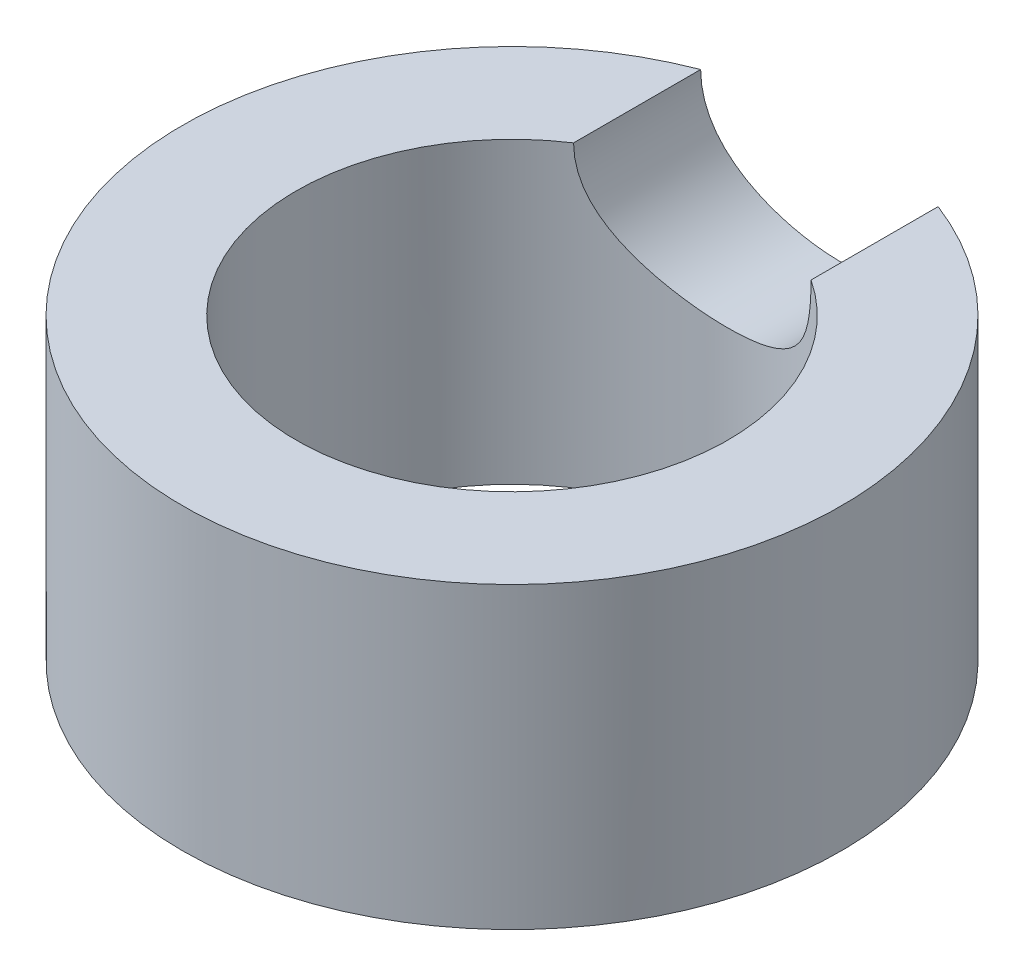
ISO-10303-21;
HEADER;
FILE_DESCRIPTION(('STEP AP214'),'2;1');
FILE_NAME('part.step','',(''),(''),'','','');
FILE_SCHEMA(('AUTOMOTIVE_DESIGN { 1 0 10303 214 1 1 1 1 }'));
ENDSEC;
DATA;
#1=APPLICATION_CONTEXT('core data for automotive mechanical design processes');
#2=APPLICATION_PROTOCOL_DEFINITION('international standard','automotive_design',2000,#1);
#3=PRODUCT_CONTEXT('',#1,'mechanical');
#4=PRODUCT('Part','Part','',(#3));
#5=PRODUCT_RELATED_PRODUCT_CATEGORY('part','',(#4));
#6=PRODUCT_DEFINITION_FORMATION('','',#4);
#7=PRODUCT_DEFINITION_CONTEXT('part definition',#1,'design');
#8=PRODUCT_DEFINITION('design','',#6,#7);
#9=PRODUCT_DEFINITION_SHAPE('','',#8);
#10=(LENGTH_UNIT() NAMED_UNIT(*) SI_UNIT(.MILLI.,.METRE.));
#11=(NAMED_UNIT(*) PLANE_ANGLE_UNIT() SI_UNIT($,.RADIAN.));
#12=(NAMED_UNIT(*) SI_UNIT($,.STERADIAN.) SOLID_ANGLE_UNIT());
#13=UNCERTAINTY_MEASURE_WITH_UNIT(LENGTH_MEASURE(1.E-05),#10,'distance_accuracy_value','');
#14=(GEOMETRIC_REPRESENTATION_CONTEXT(3) GLOBAL_UNCERTAINTY_ASSIGNED_CONTEXT((#13)) GLOBAL_UNIT_ASSIGNED_CONTEXT((#10,
#11,#12)) REPRESENTATION_CONTEXT('',''));
#15=CARTESIAN_POINT('',(0.,0.,0.));
#16=DIRECTION('',(0.,0.,1.));
#17=DIRECTION('',(1.,0.,0.));
#18=AXIS2_PLACEMENT_3D('',#15,#16,#17);
#19=CARTESIAN_POINT('',(0.,26.3,0.));
#20=DIRECTION('',(0.,1.,0.));
#21=DIRECTION('',(0.,0.,1.));
#22=AXIS2_PLACEMENT_3D('',#19,#20,#21);
#23=PLANE('',#22);
#24=DIRECTION('',(0.,0.,1.));
#25=VECTOR('',#24,1.);
#26=CARTESIAN_POINT('',(-10.45,26.3,-29.));
#27=LINE('',#26,#25);
#28=CARTESIAN_POINT('',(-10.45,26.3,-27.0517559504));
#29=VERTEX_POINT('',#28);
#30=CARTESIAN_POINT('',(-10.45,26.3,-15.8681284340656));
#31=VERTEX_POINT('',#30);
#32=EDGE_CURVE('E54',#29,#31,#27,.T.);
#33=ORIENTED_EDGE('',*,*,#32,.F.);
#34=CARTESIAN_POINT('',(0.,26.3,0.));
#35=DIRECTION('',(0.,1.,0.));
#36=DIRECTION('',(0.,0.,1.));
#37=AXIS2_PLACEMENT_3D('',#34,#35,#36);
#38=CIRCLE('',#37,29.);
#39=CARTESIAN_POINT('',(10.45,26.3,-27.0517559504));
#40=VERTEX_POINT('',#39);
#41=EDGE_CURVE('E48',#29,#40,#38,.T.);
#42=ORIENTED_EDGE('',*,*,#41,.T.);
#43=DIRECTION('',(0.,0.,1.));
#44=VECTOR('',#43,1.);
#45=CARTESIAN_POINT('',(10.45,26.3,-29.));
#46=LINE('',#45,#44);
#47=CARTESIAN_POINT('',(10.45,26.3,-15.8681284340656));
#48=VERTEX_POINT('',#47);
#49=EDGE_CURVE('E65',#48,#40,#46,.F.);
#50=ORIENTED_EDGE('',*,*,#49,.F.);
#51=CARTESIAN_POINT('',(0.,26.3,0.));
#52=DIRECTION('',(0.,1.,0.));
#53=DIRECTION('',(0.,0.,1.));
#54=AXIS2_PLACEMENT_3D('',#51,#52,#53);
#55=CIRCLE('',#54,19.);
#56=EDGE_CURVE('E71',#31,#48,#55,.T.);
#57=ORIENTED_EDGE('',*,*,#56,.F.);
#58=EDGE_LOOP('',(#33,#42,#50,#57));
#59=FACE_BOUND('',#58,.T.);
#60=ADVANCED_FACE('F33',(#59),#23,.T.);
#61=CARTESIAN_POINT('',(0.,0.,0.));
#62=DIRECTION('',(0.,1.,0.));
#63=DIRECTION('',(0.,0.,1.));
#64=AXIS2_PLACEMENT_3D('',#61,#62,#63);
#65=PLANE('',#64);
#66=CARTESIAN_POINT('',(0.,0.,0.));
#67=DIRECTION('',(0.,1.,0.));
#68=DIRECTION('',(0.,0.,1.));
#69=AXIS2_PLACEMENT_3D('',#66,#67,#68);
#70=CIRCLE('',#69,29.);
#71=CARTESIAN_POINT('',(0.,0.,29.));
#72=VERTEX_POINT('',#71);
#73=EDGE_CURVE('E76',#72,#72,#70,.T.);
#74=ORIENTED_EDGE('',*,*,#73,.F.);
#75=EDGE_LOOP('',(#74));
#76=FACE_BOUND('',#75,.T.);
#77=CARTESIAN_POINT('',(0.,0.,0.));
#78=DIRECTION('',(0.,1.,0.));
#79=DIRECTION('',(0.,0.,1.));
#80=AXIS2_PLACEMENT_3D('',#77,#78,#79);
#81=CIRCLE('',#80,19.);
#82=CARTESIAN_POINT('',(0.,0.,19.));
#83=VERTEX_POINT('',#82);
#84=EDGE_CURVE('E77',#83,#83,#81,.T.);
#85=ORIENTED_EDGE('',*,*,#84,.T.);
#86=EDGE_LOOP('',(#85));
#87=FACE_BOUND('',#86,.T.);
#88=ADVANCED_FACE('F96',(#76,#87),#65,.F.);
#89=CARTESIAN_POINT('',(0.,26.3,0.));
#90=DIRECTION('',(0.,-1.,0.));
#91=DIRECTION('',(0.,0.,-1.));
#92=AXIS2_PLACEMENT_3D('',#89,#90,#91);
#93=CYLINDRICAL_SURFACE('',#92,29.);
#94=ORIENTED_EDGE('',*,*,#41,.F.);
#95=CARTESIAN_POINT('',(-10.45,26.3,-27.0517559504));
#96=CARTESIAN_POINT('',(-10.4500420347106,26.0164141954072,-27.0517043468938));
#97=CARTESIAN_POINT('',(-10.4384582900409,25.7328484891242,-27.0562135064838));
#98=CARTESIAN_POINT('',(-10.3923533101106,25.1679492759978,-27.0739748153919));
#99=CARTESIAN_POINT('',(-10.3578392161113,24.8866151017773,-27.0872242426955));
#100=CARTESIAN_POINT('',(-10.2663397274534,24.3291208230481,-27.1220299848386));
#101=CARTESIAN_POINT('',(-10.2094294851695,24.0529466172667,-27.1435585129282));
#102=CARTESIAN_POINT('',(-10.0736989221395,23.5067456528368,-27.1942248619088));
#103=CARTESIAN_POINT('',(-9.99487760715423,23.2367191737498,-27.2233630280918));
#104=CARTESIAN_POINT('',(-9.81612541506079,22.704890681953,-27.2883252534546));
#105=CARTESIAN_POINT('',(-9.71621576569784,22.4430807005817,-27.3241425851209));
#106=CARTESIAN_POINT('',(-9.49602608490442,21.9289327238641,-27.4014434152163));
#107=CARTESIAN_POINT('',(-9.37573845850375,21.6765983030991,-27.4429290251205));
#108=CARTESIAN_POINT('',(-9.11565980665934,21.1828580662941,-27.5304116973908));
#109=CARTESIAN_POINT('',(-8.97585950061417,20.9414575234054,-27.5764109033989));
#110=CARTESIAN_POINT('',(-8.67774496392956,20.471038312997,-27.6716682434378));
#111=CARTESIAN_POINT('',(-8.51942948657005,20.2420204807881,-27.7209265968263));
#112=CARTESIAN_POINT('',(-8.1783532178767,19.7884057396902,-27.8235070049463));
#113=CARTESIAN_POINT('',(-7.99485172295566,19.5643844132757,-27.8769128700475));
#114=CARTESIAN_POINT('',(-7.60999364051448,19.1324216665352,-27.984422606139));
#115=CARTESIAN_POINT('',(-7.4086366635212,18.9244805971454,-28.038526492333));
#116=CARTESIAN_POINT('',(-6.98922455227901,18.5258793935119,-28.1460051192097));
#117=CARTESIAN_POINT('',(-6.77116606714592,18.3352227439477,-28.1993797110269));
#118=CARTESIAN_POINT('',(-6.31966720373456,17.9724451862077,-28.30398376654));
#119=CARTESIAN_POINT('',(-6.08622729607372,17.800323711345,-28.355213295789));
#120=CARTESIAN_POINT('',(-5.59776540045549,17.4706717808932,-28.4557396366489));
#121=CARTESIAN_POINT('',(-5.34229576701858,17.313769667686,-28.5049251534369));
#122=CARTESIAN_POINT('',(-4.81819953670834,17.0222128334194,-28.598177522385));
#123=CARTESIAN_POINT('',(-4.54957824539634,16.8875492353605,-28.6422464148639));
#124=CARTESIAN_POINT('',(-4.0009304665911,16.6415619344381,-28.7240224277536));
#125=CARTESIAN_POINT('',(-3.72090469945483,16.5302367601392,-28.7617299492052));
#126=CARTESIAN_POINT('',(-3.15147124006535,16.331970836778,-28.829679557322));
#127=CARTESIAN_POINT('',(-2.86206402532538,16.2450288487852,-28.8599220232835));
#128=CARTESIAN_POINT('',(-2.28785493498111,16.0993921327907,-28.9109917080171));
#129=CARTESIAN_POINT('',(-2.00333408881766,16.0397041116403,-28.9321479733921));
#130=CARTESIAN_POINT('',(-1.42982129044734,15.9441991641431,-28.9661546281748));
#131=CARTESIAN_POINT('',(-1.14082944731271,15.9083816563995,-28.9790052198775));
#132=CARTESIAN_POINT('',(-0.560678879709502,15.8609949871443,-28.9960313858068));
#133=CARTESIAN_POINT('',(-0.26952068989115,15.8494200296107,-29.0002090335992));
#134=CARTESIAN_POINT('',(0.312734806425992,15.8506246465023,-28.9997748676108));
#135=CARTESIAN_POINT('',(0.603832114382947,15.8634035489806,-28.9951632963333));
#136=CARTESIAN_POINT('',(1.17038196262185,15.9120354464162,-28.9776953432902));
#137=CARTESIAN_POINT('',(1.44594031930987,15.9468046299265,-28.9652263232189));
#138=CARTESIAN_POINT('',(1.99297364278444,16.0380584371896,-28.9327345282788));
#139=CARTESIAN_POINT('',(2.2644487568015,16.0945422760117,-28.9127120264502));
#140=CARTESIAN_POINT('',(2.80148216586523,16.2287138066125,-28.865625989761));
#141=CARTESIAN_POINT('',(3.06704032483467,16.3064019855021,-28.8385622931492));
#142=CARTESIAN_POINT('',(3.59051770846455,16.4823153444254,-28.7780752435371));
#143=CARTESIAN_POINT('',(3.84843674464674,16.580541030695,-28.7446517337734));
#144=CARTESIAN_POINT('',(4.35857346083338,16.7982467749626,-28.6717657468143));
#145=CARTESIAN_POINT('',(4.61066189598389,16.9180035257151,-28.6322257208561));
#146=CARTESIAN_POINT('',(5.10393720166782,17.1769548805522,-28.5484227923349));
#147=CARTESIAN_POINT('',(5.34512009308556,17.3161565049481,-28.5041581853929));
#148=CARTESIAN_POINT('',(5.8151378714156,17.6130019144401,-28.411996307252));
#149=CARTESIAN_POINT('',(6.04397205581615,17.7706467471483,-28.3640988297529));
#150=CARTESIAN_POINT('',(6.48804335191334,18.1033677864734,-28.2658277976439));
#151=CARTESIAN_POINT('',(6.70327959286284,18.2784451075379,-28.2154540848342));
#152=CARTESIAN_POINT('',(7.13029934974788,18.6549560262958,-28.1106697752738));
#153=CARTESIAN_POINT('',(7.34125927844249,18.8573049611028,-28.0561885814523));
#154=CARTESIAN_POINT('',(7.74550895494481,19.2789671559337,-27.947288313059));
#155=CARTESIAN_POINT('',(7.9387981319775,19.4982809635103,-27.8928692405497));
#156=CARTESIAN_POINT('',(8.30657087260514,19.9526511640103,-27.7855645190033));
#157=CARTESIAN_POINT('',(8.48104707362154,20.1877136623549,-27.7326794761947));
#158=CARTESIAN_POINT('',(8.80993426692911,20.6721004668433,-27.6299610342489));
#159=CARTESIAN_POINT('',(8.96434614832551,20.9214241403297,-27.5801274999428));
#160=CARTESIAN_POINT('',(9.25486016428928,21.4379432978285,-27.4840217354911));
#161=CARTESIAN_POINT('',(9.39053562890229,21.7053960717039,-27.43784037231));
#162=CARTESIAN_POINT('',(9.63865789391977,22.2516996773991,-27.3516640412208));
#163=CARTESIAN_POINT('',(9.75111447705434,22.5305456493991,-27.311666469709));
#164=CARTESIAN_POINT('',(9.9517074600007,23.0974526394746,-27.2392162699204));
#165=CARTESIAN_POINT('',(10.0398714660334,23.3855027788086,-27.2067550839143));
#166=CARTESIAN_POINT('',(10.1911151141635,23.9688149965805,-27.1504632228316));
#167=CARTESIAN_POINT('',(10.2542061224131,24.2640737426149,-27.1266286375619));
#168=CARTESIAN_POINT('',(10.3527968321001,24.8485837187472,-27.0891570823594));
#169=CARTESIAN_POINT('',(10.3892264665924,25.137656165093,-27.0751771130261));
#170=CARTESIAN_POINT('',(10.43783778974,25.717811231046,-27.0564531568833));
#171=CARTESIAN_POINT('',(10.4500455895101,26.0088913462169,-27.0516992245359));
#172=CARTESIAN_POINT('',(10.45,26.3,-27.0517559504));
#173=B_SPLINE_CURVE_WITH_KNOTS('',3,(#95,#96,#97,#98,#99,#100,#101,#102,#103,#104,#105,#106,
#107,#108,#109,#110,#111,#112,#113,#114,#115,#116,#117,#118,#119,#120,#121,#122,#123,#124,#125,
#126,#127,#128,#129,#130,#131,#132,#133,#134,#135,#136,#137,#138,#139,#140,#141,#142,#143,#144,
#145,#146,#147,#148,#149,#150,#151,#152,#153,#154,#155,#156,#157,#158,#159,#160,#161,#162,#163,
#164,#165,#166,#167,#168,#169,#170,#171,#172),.UNSPECIFIED.,.F.,.F.,(4,2,2,2,2,2,2,2,2,2,2,2,2,
2,2,2,2,2,2,2,2,2,2,2,2,2,2,2,2,2,2,2,2,2,2,2,2,2,4),(0.,0.850453833766529,1.70064293244987,
2.54800314028428,3.39540180430426,4.24195150128671,5.08881740836092,5.93608748226966,
6.7834146400372,7.66582218735498,8.54824898694583,9.43085329714968,10.3134306152938,
11.223737519741,12.133680171924,13.0435654369885,13.9534044616266,14.8267426200457,
15.7000595064272,16.5731675722934,17.4462515486034,18.2793406273302,19.1123995947931,
19.9454777010853,20.7785763446223,21.6232656368351,22.4682606848241,23.3133037535895,
24.1584008801308,25.0494334564846,25.9404948035209,26.8319036170085,27.7232729162381,
28.6324226357712,29.5411885212372,30.4489173803231,31.3562342748872,32.2301613806439,
33.1031458808552),.UNSPECIFIED.);
#174=EDGE_CURVE('E59',#29,#40,#173,.T.);
#175=ORIENTED_EDGE('',*,*,#174,.T.);
#176=EDGE_LOOP('',(#94,#175));
#177=FACE_BOUND('',#176,.T.);
#178=ORIENTED_EDGE('',*,*,#73,.T.);
#179=EDGE_LOOP('',(#178));
#180=FACE_BOUND('',#179,.T.);
#181=ADVANCED_FACE('F35',(#177,#180),#93,.T.);
#182=CARTESIAN_POINT('',(0.,26.3,0.));
#183=DIRECTION('',(0.,-1.,0.));
#184=DIRECTION('',(0.,0.,-1.));
#185=AXIS2_PLACEMENT_3D('',#182,#183,#184);
#186=CYLINDRICAL_SURFACE('',#185,19.);
#187=CARTESIAN_POINT('',(-10.45,26.3,-15.8681284340656));
#188=CARTESIAN_POINT('',(-10.4500012730181,26.1653833149891,-15.8681246559729));
#189=CARTESIAN_POINT('',(-10.4473981935161,26.0307864478376,-15.8698422115779));
#190=CARTESIAN_POINT('',(-10.4370032538798,25.7618869862102,-15.8766816326083));
#191=CARTESIAN_POINT('',(-10.4292116748264,25.6275843761886,-15.8818033136192));
#192=CARTESIAN_POINT('',(-10.3981046596639,25.2257493900968,-15.9022035166576));
#193=CARTESIAN_POINT('',(-10.3670568574151,24.9590162589393,-15.9225173529007));
#194=CARTESIAN_POINT('',(-10.2850919997626,24.4318171395036,-15.9755820898262));
#195=CARTESIAN_POINT('',(-10.2343115002847,24.1713208671769,-16.0082474732981));
#196=CARTESIAN_POINT('',(-10.1135634255716,23.6564693719258,-16.0848045161732));
#197=CARTESIAN_POINT('',(-10.0435929241274,23.4021150920111,-16.12869788762));
#198=CARTESIAN_POINT('',(-9.88553018246522,22.9018502283056,-16.2260552771701));
#199=CARTESIAN_POINT('',(-9.79749089995467,22.6559173660677,-16.2794912687168));
#200=CARTESIAN_POINT('',(-9.60403995683278,22.1729436946844,-16.3943606685431));
#201=CARTESIAN_POINT('',(-9.49862864822693,21.9359027054843,-16.4557939147708));
#202=CARTESIAN_POINT('',(-9.27108162313205,21.4712752819913,-16.5850592272797));
#203=CARTESIAN_POINT('',(-9.14891684383235,21.2437061932698,-16.6529023479392));
#204=CARTESIAN_POINT('',(-8.88879269546811,20.7992566003047,-16.7931891214218));
#205=CARTESIAN_POINT('',(-8.75083177189294,20.582377151046,-16.8656332267182));
#206=CARTESIAN_POINT('',(-8.44524660649842,20.1388371524624,-17.0208707913538));
#207=CARTESIAN_POINT('',(-8.27603504615457,19.913377165401,-17.1039735239912));
#208=CARTESIAN_POINT('',(-7.92025692286623,19.4771517454434,-17.2716010378501));
#209=CARTESIAN_POINT('',(-7.73368933213889,19.2663871840702,-17.356125903044));
#210=CARTESIAN_POINT('',(-7.34394254747332,18.8603610419234,-17.5245996758007));
#211=CARTESIAN_POINT('',(-7.14075577283886,18.6651066169124,-17.6085483013791));
#212=CARTESIAN_POINT('',(-6.71875429802651,18.2912371415642,-17.7738481776533));
#213=CARTESIAN_POINT('',(-6.49994473541626,18.1126166652579,-17.8552002696029));
#214=CARTESIAN_POINT('',(-6.02796580951804,17.7583052928639,-18.0203050555937));
#215=CARTESIAN_POINT('',(-5.77346113451381,17.5842006174535,-18.1036579714908));
#216=CARTESIAN_POINT('',(-5.24829903158589,17.2582431644075,-18.262821138262));
#217=CARTESIAN_POINT('',(-4.97764042634378,17.1063920114297,-18.3386308383007));
#218=CARTESIAN_POINT('',(-4.42196345972371,16.8265930463403,-18.4804871163755));
#219=CARTESIAN_POINT('',(-4.13695324241697,16.6986318672827,-18.5465391496878));
#220=CARTESIAN_POINT('',(-3.55446192453808,16.4680942773136,-18.6669279387466));
#221=CARTESIAN_POINT('',(-3.25698249065589,16.3655144863877,-18.7212662542732));
#222=CARTESIAN_POINT('',(-2.67716156036429,16.1946097581584,-18.8125395654125));
#223=CARTESIAN_POINT('',(-2.39561869371007,16.1241454583119,-18.8505461022332));
#224=CARTESIAN_POINT('',(-1.82629028871862,16.0067196174583,-18.9141925377618));
#225=CARTESIAN_POINT('',(-1.53850506778544,15.9597568843797,-18.9398330637093));
#226=CARTESIAN_POINT('',(-0.95933206510787,15.8900428826343,-18.9779834579204));
#227=CARTESIAN_POINT('',(-0.667946639160719,15.8672765502572,-18.9905014956532));
#228=CARTESIAN_POINT('',(-0.0840349414601825,15.8462559718408,-19.0020572982258));
#229=CARTESIAN_POINT('',(0.208491238125643,15.8479997849005,-19.0010961304523));
#230=CARTESIAN_POINT('',(0.761381928150846,15.8744937192387,-18.986537018077));
#231=CARTESIAN_POINT('',(1.02190258118581,15.896812366127,-18.97427465686));
#232=CARTESIAN_POINT('',(1.53982717952238,15.9607784045931,-18.9392788647418));
#233=CARTESIAN_POINT('',(1.79723139030732,16.0024241376779,-18.9165463323066));
#234=CARTESIAN_POINT('',(2.30717744119805,16.1045568521245,-18.8611432232997));
#235=CARTESIAN_POINT('',(2.55971918993879,16.1650441871515,-18.8284724601834));
#236=CARTESIAN_POINT('',(3.05834942150661,16.3042006089911,-18.7539343956568));
#237=CARTESIAN_POINT('',(3.30443765326291,16.3828704020179,-18.7120667370384));
#238=CARTESIAN_POINT('',(3.79129051288055,16.5585271755928,-18.6195639348381));
#239=CARTESIAN_POINT('',(4.03197210941065,16.6556978168595,-18.5688413468723));
#240=CARTESIAN_POINT('',(4.5041424402967,16.8669661949012,-18.4599953673567));
#241=CARTESIAN_POINT('',(4.73562783881112,16.981070004232,-18.4018693218507));
#242=CARTESIAN_POINT('',(5.18824121521788,17.2252674186986,-18.279417775016));
#243=CARTESIAN_POINT('',(5.40937044515481,17.3553590839996,-18.215093025991));
#244=CARTESIAN_POINT('',(5.84049432233791,17.6307105559795,-18.0814707607809));
#245=CARTESIAN_POINT('',(6.05048492934415,17.7759758105097,-18.0121714613699));
#246=CARTESIAN_POINT('',(6.48046570029448,18.0972185556614,-17.8622736907849));
#247=CARTESIAN_POINT('',(6.69910080414365,18.274818839879,-17.781261737982));
#248=CARTESIAN_POINT('',(7.12080538383843,18.646527105727,-17.6166222801085));
#249=CARTESIAN_POINT('',(7.32387371151187,18.8406363027964,-17.5329945827455));
#250=CARTESIAN_POINT('',(7.71384060763867,19.2446419237716,-17.3649587686544));
#251=CARTESIAN_POINT('',(7.90071979251648,19.4545567252083,-17.2805498467567));
#252=CARTESIAN_POINT('',(8.2572086769888,19.8890731994456,-17.1130738002932));
#253=CARTESIAN_POINT('',(8.42681820307708,20.1136750197678,-17.0300066892155));
#254=CARTESIAN_POINT('',(8.76216156562718,20.5972712232828,-16.8600984974949));
#255=CARTESIAN_POINT('',(8.92621372321557,20.8575485702563,-16.773577332291));
#256=CARTESIAN_POINT('',(9.23157338358675,21.393308113382,-16.6074766862903));
#257=CARTESIAN_POINT('',(9.37287755167582,21.6687925308484,-16.5278982240262));
#258=CARTESIAN_POINT('',(9.63098465736376,22.2327465828359,-16.3788369713242));
#259=CARTESIAN_POINT('',(9.74785006769433,22.5211807604486,-16.3093285822235));
#260=CARTESIAN_POINT('',(9.95602284359849,23.1097882905724,-16.1830919535635));
#261=CARTESIAN_POINT('',(10.0473407557039,23.409956740435,-16.1263584421653));
#262=CARTESIAN_POINT('',(10.1785121378221,23.9236751008197,-16.0437477570263));
#263=CARTESIAN_POINT('',(10.2255185262193,24.1347704625161,-16.0137780908027));
#264=CARTESIAN_POINT('',(10.3064606327971,24.5603823158968,-15.9618037153635));
#265=CARTESIAN_POINT('',(10.3404001006948,24.7748978077028,-15.9397967212684));
#266=CARTESIAN_POINT('',(10.3949890356453,25.2071568553254,-15.9042551230562));
#267=CARTESIAN_POINT('',(10.4155869370567,25.4249096474307,-15.8907533975621));
#268=CARTESIAN_POINT('',(10.443108726044,25.8617680737177,-15.8726660496449));
#269=CARTESIAN_POINT('',(10.4500248155989,26.0808744080409,-15.8680855119231));
#270=CARTESIAN_POINT('',(10.45,26.3,-15.8681284340656));
#271=B_SPLINE_CURVE_WITH_KNOTS('',3,(#187,#188,#189,#190,#191,#192,#193,#194,#195,#196,#197,
#198,#199,#200,#201,#202,#203,#204,#205,#206,#207,#208,#209,#210,#211,#212,#213,#214,#215,#216,
#217,#218,#219,#220,#221,#222,#223,#224,#225,#226,#227,#228,#229,#230,#231,#232,#233,#234,#235,
#236,#237,#238,#239,#240,#241,#242,#243,#244,#245,#246,#247,#248,#249,#250,#251,#252,#253,#254,
#255,#256,#257,#258,#259,#260,#261,#262,#263,#264,#265,#266,#267,#268,#269,#270),.UNSPECIFIED.,
.F.,.F.,(4,2,2,2,2,2,2,2,2,2,2,2,2,2,2,2,2,2,2,2,2,2,2,2,2,2,2,2,2,2,2,2,2,2,2,2,2,2,2,2,2,4),
(0.,0.403774900877855,0.807527929500474,1.61421634347207,2.41541890435949,3.21674370550548,
4.01575261388323,4.81474533411241,5.61514205241605,6.41561760618315,7.29637563173928,
8.17718584693272,9.05840010095439,9.93932588987509,10.896356113444,11.853456171935,
12.8100190971677,13.7664545692164,14.6433457334633,15.5201924145922,16.3964928857487,
17.2727239651172,18.0570787544756,18.8413662493439,19.6256684665201,20.4100011514402,
21.202569498715,21.9954227660016,22.7881799298052,23.5812227060215,24.4595921876933,
25.338026393811,26.2174982342825,27.0969789098323,28.0545593291095,29.0122799953023,
29.9675216788514,30.92236843516,31.5768566276699,32.2311568663348,32.8879711427837,
33.5451596662769),.UNSPECIFIED.);
#272=EDGE_CURVE('E11',#31,#48,#271,.T.);
#273=ORIENTED_EDGE('',*,*,#272,.F.);
#274=ORIENTED_EDGE('',*,*,#56,.T.);
#275=EDGE_LOOP('',(#273,#274));
#276=FACE_BOUND('',#275,.T.);
#277=ORIENTED_EDGE('',*,*,#84,.F.);
#278=EDGE_LOOP('',(#277));
#279=FACE_BOUND('',#278,.T.);
#280=ADVANCED_FACE('F74',(#276,#279),#186,.F.);
#281=CARTESIAN_POINT('',(0.,26.3,-29.));
#282=DIRECTION('',(0.,0.,1.));
#283=DIRECTION('',(1.,0.,0.));
#284=AXIS2_PLACEMENT_3D('',#281,#282,#283);
#285=CYLINDRICAL_SURFACE('',#284,10.45);
#286=ORIENTED_EDGE('',*,*,#32,.T.);
#287=ORIENTED_EDGE('',*,*,#272,.T.);
#288=ORIENTED_EDGE('',*,*,#49,.T.);
#289=ORIENTED_EDGE('',*,*,#174,.F.);
#290=EDGE_LOOP('',(#286,#287,#288,#289));
#291=FACE_BOUND('',#290,.T.);
#292=ADVANCED_FACE('F64',(#291),#285,.F.);
#293=CLOSED_SHELL('',(#60,#88,#181,#280,#292));
#294=MANIFOLD_SOLID_BREP('B2',#293);
#295=ADVANCED_BREP_SHAPE_REPRESENTATION('',(#18,#294),#14);
#296=SHAPE_DEFINITION_REPRESENTATION(#9,#295);
ENDSEC;
END-ISO-10303-21;
